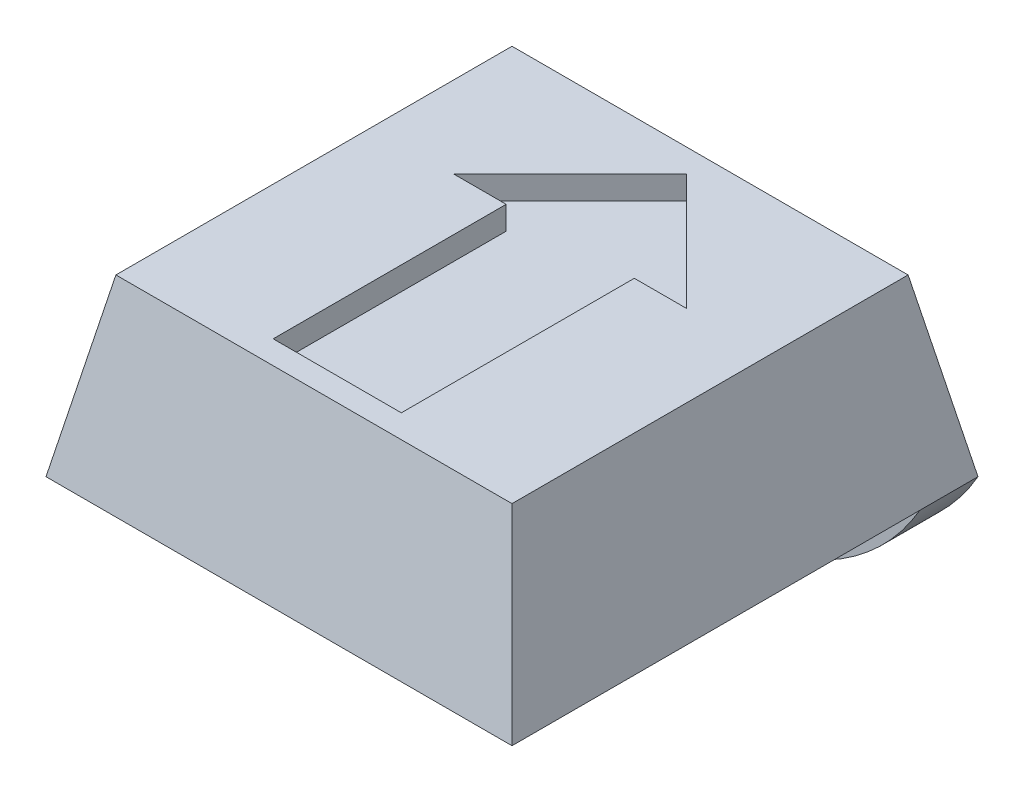
ISO-10303-21;
HEADER;
FILE_DESCRIPTION(('STEP AP214'),'2;1');
FILE_NAME('part.step','',(''),(''),'','','');
FILE_SCHEMA(('AUTOMOTIVE_DESIGN { 1 0 10303 214 1 1 1 1 }'));
ENDSEC;
DATA;
#1=APPLICATION_CONTEXT('core data for automotive mechanical design processes');
#2=APPLICATION_PROTOCOL_DEFINITION('international standard','automotive_design',2000,#1);
#3=PRODUCT_CONTEXT('',#1,'mechanical');
#4=PRODUCT('Part','Part','',(#3));
#5=PRODUCT_RELATED_PRODUCT_CATEGORY('part','',(#4));
#6=PRODUCT_DEFINITION_FORMATION('','',#4);
#7=PRODUCT_DEFINITION_CONTEXT('part definition',#1,'design');
#8=PRODUCT_DEFINITION('design','',#6,#7);
#9=PRODUCT_DEFINITION_SHAPE('','',#8);
#10=(LENGTH_UNIT() NAMED_UNIT(*) SI_UNIT(.MILLI.,.METRE.));
#11=(NAMED_UNIT(*) PLANE_ANGLE_UNIT() SI_UNIT($,.RADIAN.));
#12=(NAMED_UNIT(*) SI_UNIT($,.STERADIAN.) SOLID_ANGLE_UNIT());
#13=UNCERTAINTY_MEASURE_WITH_UNIT(LENGTH_MEASURE(1.E-05),#10,'distance_accuracy_value','');
#14=(GEOMETRIC_REPRESENTATION_CONTEXT(3) GLOBAL_UNCERTAINTY_ASSIGNED_CONTEXT((#13)) GLOBAL_UNIT_ASSIGNED_CONTEXT((#10,
#11,#12)) REPRESENTATION_CONTEXT('',''));
#15=CARTESIAN_POINT('',(0.,0.,0.));
#16=DIRECTION('',(0.,0.,1.));
#17=DIRECTION('',(1.,0.,0.));
#18=AXIS2_PLACEMENT_3D('',#15,#16,#17);
#19=CARTESIAN_POINT('',(0.,3.,0.));
#20=DIRECTION('',(0.,-1.,0.));
#21=DIRECTION('',(0.,0.,-1.));
#22=AXIS2_PLACEMENT_3D('',#19,#20,#21);
#23=PLANE('',#22);
#24=DIRECTION('',(-1.,0.,0.));
#25=VECTOR('',#24,1.);
#26=CARTESIAN_POINT('',(11.,3.,-0.6));
#27=LINE('',#26,#25);
#28=CARTESIAN_POINT('',(7.4,3.,-0.6));
#29=VERTEX_POINT('',#28);
#30=CARTESIAN_POINT('',(0.6,3.,-0.6));
#31=VERTEX_POINT('',#30);
#32=EDGE_CURVE('E245',#29,#31,#27,.T.);
#33=ORIENTED_EDGE('',*,*,#32,.F.);
#34=DIRECTION('',(0.,0.,1.));
#35=VECTOR('',#34,1.);
#36=CARTESIAN_POINT('',(7.4,3.,-8.));
#37=LINE('',#36,#35);
#38=CARTESIAN_POINT('',(7.4,3.,-7.4));
#39=VERTEX_POINT('',#38);
#40=EDGE_CURVE('E258',#39,#29,#37,.T.);
#41=ORIENTED_EDGE('',*,*,#40,.F.);
#42=DIRECTION('',(-1.,0.,0.));
#43=VECTOR('',#42,1.);
#44=CARTESIAN_POINT('',(11.,3.,-7.4));
#45=LINE('',#44,#43);
#46=CARTESIAN_POINT('',(0.599999999999999,3.,-7.4));
#47=VERTEX_POINT('',#46);
#48=EDGE_CURVE('E241',#39,#47,#45,.T.);
#49=ORIENTED_EDGE('',*,*,#48,.T.);
#50=DIRECTION('',(0.,0.,1.));
#51=VECTOR('',#50,1.);
#52=CARTESIAN_POINT('',(0.6,3.,-8.));
#53=LINE('',#52,#51);
#54=EDGE_CURVE('E261',#47,#31,#53,.T.);
#55=ORIENTED_EDGE('',*,*,#54,.T.);
#56=EDGE_LOOP('',(#33,#41,#49,#55));
#57=FACE_BOUND('',#56,.T.);
#58=DIRECTION('',(0.,0.,1.));
#59=VECTOR('',#58,1.);
#60=CARTESIAN_POINT('',(5.1,3.,0.));
#61=LINE('',#60,#59);
#62=CARTESIAN_POINT('',(5.1,3.,-5.));
#63=VERTEX_POINT('',#62);
#64=CARTESIAN_POINT('',(5.1,3.,-1.));
#65=VERTEX_POINT('',#64);
#66=EDGE_CURVE('E59',#63,#65,#61,.T.);
#67=ORIENTED_EDGE('',*,*,#66,.T.);
#68=DIRECTION('',(1.,0.,0.));
#69=VECTOR('',#68,1.);
#70=CARTESIAN_POINT('',(0.,3.,-1.));
#71=LINE('',#70,#69);
#72=CARTESIAN_POINT('',(2.9,3.,-1.));
#73=VERTEX_POINT('',#72);
#74=EDGE_CURVE('E171',#73,#65,#71,.T.);
#75=ORIENTED_EDGE('',*,*,#74,.F.);
#76=DIRECTION('',(0.,0.,1.));
#77=VECTOR('',#76,1.);
#78=CARTESIAN_POINT('',(2.9,3.,0.));
#79=LINE('',#78,#77);
#80=CARTESIAN_POINT('',(2.9,3.,-5.));
#81=VERTEX_POINT('',#80);
#82=EDGE_CURVE('E175',#81,#73,#79,.T.);
#83=ORIENTED_EDGE('',*,*,#82,.F.);
#84=DIRECTION('',(-1.,0.,0.));
#85=VECTOR('',#84,1.);
#86=CARTESIAN_POINT('',(0.,3.,-5.));
#87=LINE('',#86,#85);
#88=CARTESIAN_POINT('',(2.,3.,-5.));
#89=VERTEX_POINT('',#88);
#90=EDGE_CURVE('E194',#81,#89,#87,.T.);
#91=ORIENTED_EDGE('',*,*,#90,.T.);
#92=DIRECTION('',(0.707106781186548,0.,-0.707106781186548));
#93=VECTOR('',#92,1.);
#94=CARTESIAN_POINT('',(-1.5,3.,-1.5));
#95=LINE('',#94,#93);
#96=CARTESIAN_POINT('',(4.,3.,-7.));
#97=VERTEX_POINT('',#96);
#98=EDGE_CURVE('E198',#89,#97,#95,.T.);
#99=ORIENTED_EDGE('',*,*,#98,.T.);
#100=DIRECTION('',(0.707106781186547,0.,0.707106781186548));
#101=VECTOR('',#100,1.);
#102=CARTESIAN_POINT('',(5.5,3.,-5.5));
#103=LINE('',#102,#101);
#104=CARTESIAN_POINT('',(6.,3.,-5.));
#105=VERTEX_POINT('',#104);
#106=EDGE_CURVE('E193',#97,#105,#103,.T.);
#107=ORIENTED_EDGE('',*,*,#106,.T.);
#108=EDGE_CURVE('E190',#105,#63,#87,.T.);
#109=ORIENTED_EDGE('',*,*,#108,.T.);
#110=EDGE_LOOP('',(#67,#75,#83,#91,#99,#107,#109));
#111=FACE_BOUND('',#110,.T.);
#112=ADVANCED_FACE('F43',(#57,#111),#23,.F.);
#113=CARTESIAN_POINT('',(8.,0.,-8.));
#114=DIRECTION('',(-0.98058067569092,-0.196116135138184,0.));
#115=DIRECTION('',(0.196116135138184,-0.98058067569092,0.));
#116=AXIS2_PLACEMENT_3D('',#113,#114,#115);
#117=PLANE('',#116);
#118=DIRECTION('',(-0.192450089729875,0.962250448649376,-0.192450089729875));
#119=VECTOR('',#118,1.);
#120=CARTESIAN_POINT('',(7.7037037037037,1.48148148148148,-0.296296296296296));
#121=LINE('',#120,#119);
#122=CARTESIAN_POINT('',(8.,0.,0.));
#123=VERTEX_POINT('',#122);
#124=EDGE_CURVE('E255',#123,#29,#121,.T.);
#125=ORIENTED_EDGE('',*,*,#124,.F.);
#126=DIRECTION('',(0.,0.,-1.));
#127=VECTOR('',#126,1.);
#128=CARTESIAN_POINT('',(8.,0.,0.));
#129=LINE('',#128,#127);
#130=CARTESIAN_POINT('',(8.,0.,-7.));
#131=VERTEX_POINT('',#130);
#132=EDGE_CURVE('E274',#123,#131,#129,.T.);
#133=ORIENTED_EDGE('',*,*,#132,.T.);
#134=DIRECTION('',(0.,0.,1.));
#135=VECTOR('',#134,1.);
#136=CARTESIAN_POINT('',(8.,0.,-8.));
#137=LINE('',#136,#135);
#138=CARTESIAN_POINT('',(8.,0.,-8.));
#139=VERTEX_POINT('',#138);
#140=EDGE_CURVE('E208',#139,#131,#137,.T.);
#141=ORIENTED_EDGE('',*,*,#140,.F.);
#142=DIRECTION('',(0.192450089729875,-0.962250448649376,-0.192450089729875));
#143=VECTOR('',#142,1.);
#144=CARTESIAN_POINT('',(8.,0.,-8.));
#145=LINE('',#144,#143);
#146=EDGE_CURVE('E248',#39,#139,#145,.T.);
#147=ORIENTED_EDGE('',*,*,#146,.F.);
#148=ORIENTED_EDGE('',*,*,#40,.T.);
#149=EDGE_LOOP('',(#125,#133,#141,#147,#148));
#150=FACE_BOUND('',#149,.T.);
#151=ADVANCED_FACE('F342',(#150),#117,.F.);
#152=CARTESIAN_POINT('',(0.,0.,-8.));
#153=DIRECTION('',(0.98058067569092,-0.196116135138184,0.));
#154=DIRECTION('',(0.196116135138184,0.98058067569092,0.));
#155=AXIS2_PLACEMENT_3D('',#152,#153,#154);
#156=PLANE('',#155);
#157=DIRECTION('',(-0.192450089729875,-0.962250448649376,0.192450089729875));
#158=VECTOR('',#157,1.);
#159=CARTESIAN_POINT('',(0.296296296296296,1.48148148148148,-0.296296296296296));
#160=LINE('',#159,#158);
#161=CARTESIAN_POINT('',(0.,0.,0.));
#162=VERTEX_POINT('',#161);
#163=EDGE_CURVE('E302',#31,#162,#160,.T.);
#164=ORIENTED_EDGE('',*,*,#163,.F.);
#165=ORIENTED_EDGE('',*,*,#54,.F.);
#166=DIRECTION('',(0.192450089729875,0.962250448649376,0.192450089729875));
#167=VECTOR('',#166,1.);
#168=CARTESIAN_POINT('',(0.,0.,-8.));
#169=LINE('',#168,#167);
#170=CARTESIAN_POINT('',(0.,0.,-8.));
#171=VERTEX_POINT('',#170);
#172=EDGE_CURVE('E273',#171,#47,#169,.T.);
#173=ORIENTED_EDGE('',*,*,#172,.F.);
#174=DIRECTION('',(0.,0.,1.));
#175=VECTOR('',#174,1.);
#176=CARTESIAN_POINT('',(0.,0.,0.));
#177=LINE('',#176,#175);
#178=CARTESIAN_POINT('',(0.,0.,-7.));
#179=VERTEX_POINT('',#178);
#180=EDGE_CURVE('E278',#171,#179,#177,.T.);
#181=ORIENTED_EDGE('',*,*,#180,.T.);
#182=EDGE_CURVE('E265',#179,#162,#177,.T.);
#183=ORIENTED_EDGE('',*,*,#182,.T.);
#184=EDGE_LOOP('',(#164,#165,#173,#181,#183));
#185=FACE_BOUND('',#184,.T.);
#186=ADVANCED_FACE('F326',(#185),#156,.F.);
#187=CARTESIAN_POINT('',(0.,0.,0.));
#188=DIRECTION('',(0.,-1.,0.));
#189=DIRECTION('',(0.,0.,-1.));
#190=AXIS2_PLACEMENT_3D('',#187,#188,#189);
#191=PLANE('',#190);
#192=DIRECTION('',(-1.,0.,0.));
#193=VECTOR('',#192,1.);
#194=CARTESIAN_POINT('',(0.,0.,-7.));
#195=LINE('',#194,#193);
#196=EDGE_CURVE('E228',#131,#179,#195,.T.);
#197=ORIENTED_EDGE('',*,*,#196,.F.);
#198=ORIENTED_EDGE('',*,*,#132,.F.);
#199=DIRECTION('',(1.,0.,0.));
#200=VECTOR('',#199,1.);
#201=CARTESIAN_POINT('',(0.,0.,0.));
#202=LINE('',#201,#200);
#203=EDGE_CURVE('E275',#162,#123,#202,.T.);
#204=ORIENTED_EDGE('',*,*,#203,.F.);
#205=ORIENTED_EDGE('',*,*,#182,.F.);
#206=EDGE_LOOP('',(#197,#198,#204,#205));
#207=FACE_BOUND('',#206,.T.);
#208=CARTESIAN_POINT('',(4.,0.,-3.75));
#209=DIRECTION('',(0.,-1.,0.));
#210=DIRECTION('',(0.,0.,-1.));
#211=AXIS2_PLACEMENT_3D('',#208,#209,#210);
#212=CIRCLE('',#211,1.75);
#213=CARTESIAN_POINT('',(4.,0.,-5.5));
#214=VERTEX_POINT('',#213);
#215=EDGE_CURVE('E231',#214,#214,#212,.T.);
#216=ORIENTED_EDGE('',*,*,#215,.F.);
#217=EDGE_LOOP('',(#216));
#218=FACE_BOUND('',#217,.T.);
#219=ADVANCED_FACE('F337',(#207,#218),#191,.T.);
#220=CARTESIAN_POINT('',(11.,3.,-7.4));
#221=DIRECTION('',(0.,0.196116135138184,-0.98058067569092));
#222=DIRECTION('',(0.,0.98058067569092,0.196116135138184));
#223=AXIS2_PLACEMENT_3D('',#220,#221,#222);
#224=PLANE('',#223);
#225=ORIENTED_EDGE('',*,*,#146,.T.);
#226=DIRECTION('',(-1.,0.,0.));
#227=VECTOR('',#226,1.);
#228=CARTESIAN_POINT('',(0.,0.,-8.));
#229=LINE('',#228,#227);
#230=EDGE_CURVE('E269',#139,#171,#229,.T.);
#231=ORIENTED_EDGE('',*,*,#230,.T.);
#232=ORIENTED_EDGE('',*,*,#172,.T.);
#233=ORIENTED_EDGE('',*,*,#48,.F.);
#234=EDGE_LOOP('',(#225,#231,#232,#233));
#235=FACE_BOUND('',#234,.T.);
#236=ADVANCED_FACE('F321',(#235),#224,.T.);
#237=CARTESIAN_POINT('',(11.,0.,0.));
#238=DIRECTION('',(0.,0.196116135138184,0.98058067569092));
#239=DIRECTION('',(0.,-0.98058067569092,0.196116135138184));
#240=AXIS2_PLACEMENT_3D('',#237,#238,#239);
#241=PLANE('',#240);
#242=ORIENTED_EDGE('',*,*,#124,.T.);
#243=ORIENTED_EDGE('',*,*,#32,.T.);
#244=ORIENTED_EDGE('',*,*,#163,.T.);
#245=ORIENTED_EDGE('',*,*,#203,.T.);
#246=EDGE_LOOP('',(#242,#243,#244,#245));
#247=FACE_BOUND('',#246,.T.);
#248=ADVANCED_FACE('F366',(#247),#241,.T.);
#249=CARTESIAN_POINT('',(4.,0.4,-3.75));
#250=DIRECTION('',(0.,-1.,0.));
#251=DIRECTION('',(0.,0.,-1.));
#252=AXIS2_PLACEMENT_3D('',#249,#250,#251);
#253=CYLINDRICAL_SURFACE('',#252,1.75);
#254=CARTESIAN_POINT('',(4.,0.4,-3.75));
#255=DIRECTION('',(0.,-1.,0.));
#256=DIRECTION('',(0.,0.,-1.));
#257=AXIS2_PLACEMENT_3D('',#254,#255,#256);
#258=CIRCLE('',#257,1.75);
#259=CARTESIAN_POINT('',(4.,0.4,-5.5));
#260=VERTEX_POINT('',#259);
#261=EDGE_CURVE('E237',#260,#260,#258,.T.);
#262=ORIENTED_EDGE('',*,*,#261,.F.);
#263=EDGE_LOOP('',(#262));
#264=FACE_BOUND('',#263,.T.);
#265=ORIENTED_EDGE('',*,*,#215,.T.);
#266=EDGE_LOOP('',(#265));
#267=FACE_BOUND('',#266,.T.);
#268=ADVANCED_FACE('F373',(#264,#267),#253,.F.);
#269=CARTESIAN_POINT('',(4.,0.4,-3.75));
#270=DIRECTION('',(0.,-1.,0.));
#271=DIRECTION('',(0.,0.,-1.));
#272=AXIS2_PLACEMENT_3D('',#269,#270,#271);
#273=PLANE('',#272);
#274=ORIENTED_EDGE('',*,*,#261,.T.);
#275=EDGE_LOOP('',(#274));
#276=FACE_BOUND('',#275,.T.);
#277=ADVANCED_FACE('F377',(#276),#273,.T.);
#278=CARTESIAN_POINT('',(0.,-2.,-8.));
#279=DIRECTION('',(0.,0.,1.));
#280=DIRECTION('',(1.,0.,0.));
#281=AXIS2_PLACEMENT_3D('',#278,#279,#280);
#282=PLANE('',#281);
#283=ORIENTED_EDGE('',*,*,#230,.F.);
#284=CARTESIAN_POINT('',(4.53589838486225,2.,-8.));
#285=DIRECTION('',(0.,0.,1.));
#286=DIRECTION('',(1.,0.,0.));
#287=AXIS2_PLACEMENT_3D('',#284,#285,#286);
#288=CIRCLE('',#287,4.);
#289=CARTESIAN_POINT('',(4.53589838486225,-2.,-8.));
#290=VERTEX_POINT('',#289);
#291=EDGE_CURVE('E11',#139,#290,#288,.F.);
#292=ORIENTED_EDGE('',*,*,#291,.T.);
#293=DIRECTION('',(1.,0.,0.));
#294=VECTOR('',#293,1.);
#295=CARTESIAN_POINT('',(0.,-2.,-8.));
#296=LINE('',#295,#294);
#297=CARTESIAN_POINT('',(3.46410161513775,-2.,-8.));
#298=VERTEX_POINT('',#297);
#299=EDGE_CURVE('E223',#298,#290,#296,.T.);
#300=ORIENTED_EDGE('',*,*,#299,.F.);
#301=CARTESIAN_POINT('',(3.46410161513775,2.,-8.));
#302=DIRECTION('',(0.,0.,1.));
#303=DIRECTION('',(1.,0.,0.));
#304=AXIS2_PLACEMENT_3D('',#301,#302,#303);
#305=CIRCLE('',#304,4.);
#306=EDGE_CURVE('E52',#298,#171,#305,.F.);
#307=ORIENTED_EDGE('',*,*,#306,.T.);
#308=EDGE_LOOP('',(#283,#292,#300,#307));
#309=FACE_BOUND('',#308,.T.);
#310=ADVANCED_FACE('F314',(#309),#282,.F.);
#311=CARTESIAN_POINT('',(0.,-2.,-7.));
#312=DIRECTION('',(0.,0.,-1.));
#313=DIRECTION('',(-1.,0.,0.));
#314=AXIS2_PLACEMENT_3D('',#311,#312,#313);
#315=PLANE('',#314);
#316=DIRECTION('',(-1.,0.,0.));
#317=VECTOR('',#316,1.);
#318=CARTESIAN_POINT('',(0.,-2.,-7.));
#319=LINE('',#318,#317);
#320=CARTESIAN_POINT('',(4.53589838486225,-2.,-7.));
#321=VERTEX_POINT('',#320);
#322=CARTESIAN_POINT('',(3.46410161513775,-2.,-7.));
#323=VERTEX_POINT('',#322);
#324=EDGE_CURVE('E227',#321,#323,#319,.T.);
#325=ORIENTED_EDGE('',*,*,#324,.F.);
#326=CARTESIAN_POINT('',(4.53589838486225,2.,-7.));
#327=DIRECTION('',(0.,0.,-1.));
#328=DIRECTION('',(-1.,0.,0.));
#329=AXIS2_PLACEMENT_3D('',#326,#327,#328);
#330=CIRCLE('',#329,4.);
#331=EDGE_CURVE('E308',#321,#131,#330,.F.);
#332=ORIENTED_EDGE('',*,*,#331,.T.);
#333=ORIENTED_EDGE('',*,*,#196,.T.);
#334=CARTESIAN_POINT('',(3.46410161513775,2.,-7.));
#335=DIRECTION('',(0.,0.,-1.));
#336=DIRECTION('',(-1.,0.,0.));
#337=AXIS2_PLACEMENT_3D('',#334,#335,#336);
#338=CIRCLE('',#337,4.);
#339=EDGE_CURVE('E67',#179,#323,#338,.F.);
#340=ORIENTED_EDGE('',*,*,#339,.T.);
#341=EDGE_LOOP('',(#325,#332,#333,#340));
#342=FACE_BOUND('',#341,.T.);
#343=ADVANCED_FACE('F332',(#342),#315,.F.);
#344=CARTESIAN_POINT('',(0.,-2.,0.));
#345=DIRECTION('',(0.,1.,0.));
#346=DIRECTION('',(0.,0.,1.));
#347=AXIS2_PLACEMENT_3D('',#344,#345,#346);
#348=PLANE('',#347);
#349=ORIENTED_EDGE('',*,*,#299,.T.);
#350=DIRECTION('',(0.,0.,1.));
#351=VECTOR('',#350,1.);
#352=CARTESIAN_POINT('',(4.53589838486225,-2.,0.));
#353=LINE('',#352,#351);
#354=EDGE_CURVE('E301',#290,#321,#353,.T.);
#355=ORIENTED_EDGE('',*,*,#354,.T.);
#356=ORIENTED_EDGE('',*,*,#324,.T.);
#357=DIRECTION('',(0.,0.,-1.));
#358=VECTOR('',#357,1.);
#359=CARTESIAN_POINT('',(3.46410161513775,-2.,0.));
#360=LINE('',#359,#358);
#361=EDGE_CURVE('E297',#323,#298,#360,.T.);
#362=ORIENTED_EDGE('',*,*,#361,.T.);
#363=EDGE_LOOP('',(#349,#355,#356,#362));
#364=FACE_BOUND('',#363,.T.);
#365=ADVANCED_FACE('F330',(#364),#348,.F.);
#366=CARTESIAN_POINT('',(4.53589838486225,2.,-8.));
#367=DIRECTION('',(0.,0.,1.));
#368=DIRECTION('',(1.,0.,0.));
#369=AXIS2_PLACEMENT_3D('',#366,#367,#368);
#370=CYLINDRICAL_SURFACE('',#369,4.);
#371=ORIENTED_EDGE('',*,*,#291,.F.);
#372=ORIENTED_EDGE('',*,*,#140,.T.);
#373=ORIENTED_EDGE('',*,*,#331,.F.);
#374=ORIENTED_EDGE('',*,*,#354,.F.);
#375=EDGE_LOOP('',(#371,#372,#373,#374));
#376=FACE_BOUND('',#375,.T.);
#377=ADVANCED_FACE('F343',(#376),#370,.T.);
#378=CARTESIAN_POINT('',(3.46410161513775,2.,-8.));
#379=DIRECTION('',(0.,0.,-1.));
#380=DIRECTION('',(-1.,0.,0.));
#381=AXIS2_PLACEMENT_3D('',#378,#379,#380);
#382=CYLINDRICAL_SURFACE('',#381,4.);
#383=ORIENTED_EDGE('',*,*,#339,.F.);
#384=ORIENTED_EDGE('',*,*,#180,.F.);
#385=ORIENTED_EDGE('',*,*,#306,.F.);
#386=ORIENTED_EDGE('',*,*,#361,.F.);
#387=EDGE_LOOP('',(#383,#384,#385,#386));
#388=FACE_BOUND('',#387,.T.);
#389=ADVANCED_FACE('F45',(#388),#382,.T.);
#390=CARTESIAN_POINT('',(5.1,2.6,0.));
#391=DIRECTION('',(-1.,0.,0.));
#392=DIRECTION('',(0.,0.,1.));
#393=AXIS2_PLACEMENT_3D('',#390,#391,#392);
#394=PLANE('',#393);
#395=ORIENTED_EDGE('',*,*,#66,.F.);
#396=DIRECTION('',(0.,1.,0.));
#397=VECTOR('',#396,1.);
#398=CARTESIAN_POINT('',(5.1,2.6,-5.));
#399=LINE('',#398,#397);
#400=CARTESIAN_POINT('',(5.1,2.6,-5.));
#401=VERTEX_POINT('',#400);
#402=EDGE_CURVE('E150',#401,#63,#399,.T.);
#403=ORIENTED_EDGE('',*,*,#402,.F.);
#404=DIRECTION('',(0.,0.,1.));
#405=VECTOR('',#404,1.);
#406=CARTESIAN_POINT('',(5.1,2.6,0.));
#407=LINE('',#406,#405);
#408=CARTESIAN_POINT('',(5.1,2.6,-1.));
#409=VERTEX_POINT('',#408);
#410=EDGE_CURVE('E158',#401,#409,#407,.T.);
#411=ORIENTED_EDGE('',*,*,#410,.T.);
#412=DIRECTION('',(0.,1.,0.));
#413=VECTOR('',#412,1.);
#414=CARTESIAN_POINT('',(5.1,2.6,-1.));
#415=LINE('',#414,#413);
#416=EDGE_CURVE('E205',#409,#65,#415,.T.);
#417=ORIENTED_EDGE('',*,*,#416,.T.);
#418=EDGE_LOOP('',(#395,#403,#411,#417));
#419=FACE_BOUND('',#418,.T.);
#420=ADVANCED_FACE('F161',(#419),#394,.T.);
#421=CARTESIAN_POINT('',(0.,2.6,-1.));
#422=DIRECTION('',(0.,0.,1.));
#423=DIRECTION('',(1.,0.,0.));
#424=AXIS2_PLACEMENT_3D('',#421,#422,#423);
#425=PLANE('',#424);
#426=ORIENTED_EDGE('',*,*,#74,.T.);
#427=ORIENTED_EDGE('',*,*,#416,.F.);
#428=DIRECTION('',(1.,0.,0.));
#429=VECTOR('',#428,1.);
#430=CARTESIAN_POINT('',(0.,2.6,-1.));
#431=LINE('',#430,#429);
#432=CARTESIAN_POINT('',(2.9,2.6,-1.));
#433=VERTEX_POINT('',#432);
#434=EDGE_CURVE('E164',#433,#409,#431,.T.);
#435=ORIENTED_EDGE('',*,*,#434,.F.);
#436=DIRECTION('',(0.,1.,0.));
#437=VECTOR('',#436,1.);
#438=CARTESIAN_POINT('',(2.9,2.6,-1.));
#439=LINE('',#438,#437);
#440=EDGE_CURVE('E209',#433,#73,#439,.T.);
#441=ORIENTED_EDGE('',*,*,#440,.T.);
#442=EDGE_LOOP('',(#426,#427,#435,#441));
#443=FACE_BOUND('',#442,.T.);
#444=ADVANCED_FACE('F388',(#443),#425,.F.);
#445=CARTESIAN_POINT('',(2.9,2.6,0.));
#446=DIRECTION('',(-1.,0.,0.));
#447=DIRECTION('',(0.,0.,1.));
#448=AXIS2_PLACEMENT_3D('',#445,#446,#447);
#449=PLANE('',#448);
#450=ORIENTED_EDGE('',*,*,#82,.T.);
#451=ORIENTED_EDGE('',*,*,#440,.F.);
#452=DIRECTION('',(0.,0.,1.));
#453=VECTOR('',#452,1.);
#454=CARTESIAN_POINT('',(2.9,2.6,0.));
#455=LINE('',#454,#453);
#456=CARTESIAN_POINT('',(2.9,2.6,-5.));
#457=VERTEX_POINT('',#456);
#458=EDGE_CURVE('E183',#457,#433,#455,.T.);
#459=ORIENTED_EDGE('',*,*,#458,.F.);
#460=DIRECTION('',(0.,1.,0.));
#461=VECTOR('',#460,1.);
#462=CARTESIAN_POINT('',(2.9,2.6,-5.));
#463=LINE('',#462,#461);
#464=EDGE_CURVE('E212',#457,#81,#463,.T.);
#465=ORIENTED_EDGE('',*,*,#464,.T.);
#466=EDGE_LOOP('',(#450,#451,#459,#465));
#467=FACE_BOUND('',#466,.T.);
#468=ADVANCED_FACE('F400',(#467),#449,.F.);
#469=CARTESIAN_POINT('',(0.,2.6,-5.));
#470=DIRECTION('',(0.,0.,-1.));
#471=DIRECTION('',(-1.,0.,0.));
#472=AXIS2_PLACEMENT_3D('',#469,#470,#471);
#473=PLANE('',#472);
#474=ORIENTED_EDGE('',*,*,#90,.F.);
#475=ORIENTED_EDGE('',*,*,#464,.F.);
#476=DIRECTION('',(-1.,0.,0.));
#477=VECTOR('',#476,1.);
#478=CARTESIAN_POINT('',(0.,2.6,-5.));
#479=LINE('',#478,#477);
#480=CARTESIAN_POINT('',(2.,2.6,-5.));
#481=VERTEX_POINT('',#480);
#482=EDGE_CURVE('E160',#457,#481,#479,.T.);
#483=ORIENTED_EDGE('',*,*,#482,.T.);
#484=DIRECTION('',(0.,1.,0.));
#485=VECTOR('',#484,1.);
#486=CARTESIAN_POINT('',(2.,2.6,-5.));
#487=LINE('',#486,#485);
#488=EDGE_CURVE('E215',#481,#89,#487,.T.);
#489=ORIENTED_EDGE('',*,*,#488,.T.);
#490=EDGE_LOOP('',(#474,#475,#483,#489));
#491=FACE_BOUND('',#490,.T.);
#492=ADVANCED_FACE('F396',(#491),#473,.T.);
#493=CARTESIAN_POINT('',(-1.5,2.6,-1.5));
#494=DIRECTION('',(0.707106781186548,0.,0.707106781186548));
#495=DIRECTION('',(0.707106781186548,0.,-0.707106781186548));
#496=AXIS2_PLACEMENT_3D('',#493,#494,#495);
#497=PLANE('',#496);
#498=ORIENTED_EDGE('',*,*,#98,.F.);
#499=ORIENTED_EDGE('',*,*,#488,.F.);
#500=DIRECTION('',(0.707106781186548,0.,-0.707106781186548));
#501=VECTOR('',#500,1.);
#502=CARTESIAN_POINT('',(-1.5,2.6,-1.5));
#503=LINE('',#502,#501);
#504=CARTESIAN_POINT('',(4.,2.6,-7.));
#505=VERTEX_POINT('',#504);
#506=EDGE_CURVE('E180',#481,#505,#503,.T.);
#507=ORIENTED_EDGE('',*,*,#506,.T.);
#508=DIRECTION('',(0.,1.,0.));
#509=VECTOR('',#508,1.);
#510=CARTESIAN_POINT('',(4.,2.6,-7.));
#511=LINE('',#510,#509);
#512=EDGE_CURVE('E218',#505,#97,#511,.T.);
#513=ORIENTED_EDGE('',*,*,#512,.T.);
#514=EDGE_LOOP('',(#498,#499,#507,#513));
#515=FACE_BOUND('',#514,.T.);
#516=ADVANCED_FACE('F392',(#515),#497,.T.);
#517=CARTESIAN_POINT('',(5.5,2.6,-5.5));
#518=DIRECTION('',(-0.707106781186548,0.,0.707106781186547));
#519=DIRECTION('',(0.707106781186547,0.,0.707106781186548));
#520=AXIS2_PLACEMENT_3D('',#517,#518,#519);
#521=PLANE('',#520);
#522=ORIENTED_EDGE('',*,*,#106,.F.);
#523=ORIENTED_EDGE('',*,*,#512,.F.);
#524=DIRECTION('',(0.707106781186547,0.,0.707106781186548));
#525=VECTOR('',#524,1.);
#526=CARTESIAN_POINT('',(5.5,2.6,-5.5));
#527=LINE('',#526,#525);
#528=CARTESIAN_POINT('',(6.,2.6,-5.));
#529=VERTEX_POINT('',#528);
#530=EDGE_CURVE('E157',#505,#529,#527,.T.);
#531=ORIENTED_EDGE('',*,*,#530,.T.);
#532=DIRECTION('',(0.,1.,0.));
#533=VECTOR('',#532,1.);
#534=CARTESIAN_POINT('',(6.,2.6,-5.));
#535=LINE('',#534,#533);
#536=EDGE_CURVE('E152',#529,#105,#535,.T.);
#537=ORIENTED_EDGE('',*,*,#536,.T.);
#538=EDGE_LOOP('',(#522,#523,#531,#537));
#539=FACE_BOUND('',#538,.T.);
#540=ADVANCED_FACE('F389',(#539),#521,.T.);
#541=ORIENTED_EDGE('',*,*,#108,.F.);
#542=ORIENTED_EDGE('',*,*,#536,.F.);
#543=EDGE_CURVE('E147',#529,#401,#479,.T.);
#544=ORIENTED_EDGE('',*,*,#543,.T.);
#545=ORIENTED_EDGE('',*,*,#402,.T.);
#546=EDGE_LOOP('',(#541,#542,#544,#545));
#547=FACE_BOUND('',#546,.T.);
#548=ADVANCED_FACE('F149',(#547),#473,.T.);
#549=CARTESIAN_POINT('',(0.,2.6,0.));
#550=DIRECTION('',(0.,1.,0.));
#551=DIRECTION('',(0.,0.,1.));
#552=AXIS2_PLACEMENT_3D('',#549,#550,#551);
#553=PLANE('',#552);
#554=ORIENTED_EDGE('',*,*,#410,.F.);
#555=ORIENTED_EDGE('',*,*,#543,.F.);
#556=ORIENTED_EDGE('',*,*,#530,.F.);
#557=ORIENTED_EDGE('',*,*,#506,.F.);
#558=ORIENTED_EDGE('',*,*,#482,.F.);
#559=ORIENTED_EDGE('',*,*,#458,.T.);
#560=ORIENTED_EDGE('',*,*,#434,.T.);
#561=EDGE_LOOP('',(#554,#555,#556,#557,#558,#559,#560));
#562=FACE_BOUND('',#561,.T.);
#563=ADVANCED_FACE('F167',(#562),#553,.T.);
#564=CLOSED_SHELL('',(#112,#151,#186,#219,#236,#248,#268,#277,#310,#343,#365,#377,#389,#420,
#444,#468,#492,#516,#540,#548,#563));
#565=MANIFOLD_SOLID_BREP('B2',#564);
#566=ADVANCED_BREP_SHAPE_REPRESENTATION('',(#18,#565),#14);
#567=SHAPE_DEFINITION_REPRESENTATION(#9,#566);
ENDSEC;
END-ISO-10303-21;
